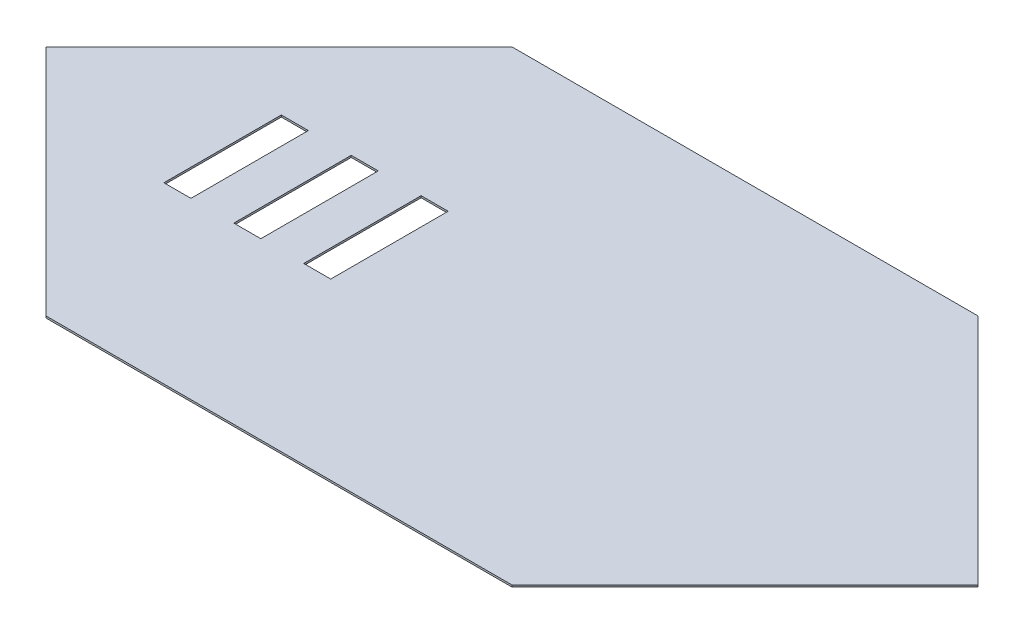
ISO-10303-21;
HEADER;
FILE_DESCRIPTION(('STEP AP214'),'2;1');
FILE_NAME('part.step','',(''),(''),'','','');
FILE_SCHEMA(('AUTOMOTIVE_DESIGN { 1 0 10303 214 1 1 1 1 }'));
ENDSEC;
DATA;
#1=APPLICATION_CONTEXT('core data for automotive mechanical design processes');
#2=APPLICATION_PROTOCOL_DEFINITION('international standard','automotive_design',2000,#1);
#3=PRODUCT_CONTEXT('',#1,'mechanical');
#4=PRODUCT('Part','Part','',(#3));
#5=PRODUCT_RELATED_PRODUCT_CATEGORY('part','',(#4));
#6=PRODUCT_DEFINITION_FORMATION('','',#4);
#7=PRODUCT_DEFINITION_CONTEXT('part definition',#1,'design');
#8=PRODUCT_DEFINITION('design','',#6,#7);
#9=PRODUCT_DEFINITION_SHAPE('','',#8);
#10=(LENGTH_UNIT() NAMED_UNIT(*) SI_UNIT(.MILLI.,.METRE.));
#11=(NAMED_UNIT(*) PLANE_ANGLE_UNIT() SI_UNIT($,.RADIAN.));
#12=(NAMED_UNIT(*) SI_UNIT($,.STERADIAN.) SOLID_ANGLE_UNIT());
#13=UNCERTAINTY_MEASURE_WITH_UNIT(LENGTH_MEASURE(1.E-05),#10,'distance_accuracy_value','');
#14=(GEOMETRIC_REPRESENTATION_CONTEXT(3) GLOBAL_UNCERTAINTY_ASSIGNED_CONTEXT((#13)) GLOBAL_UNIT_ASSIGNED_CONTEXT((#10,
#11,#12)) REPRESENTATION_CONTEXT('',''));
#15=CARTESIAN_POINT('',(0.,0.,0.));
#16=DIRECTION('',(0.,0.,1.));
#17=DIRECTION('',(1.,0.,0.));
#18=AXIS2_PLACEMENT_3D('',#15,#16,#17);
#19=CARTESIAN_POINT('',(-31.05,10.,0.));
#20=DIRECTION('',(-1.,0.,0.));
#21=DIRECTION('',(0.,0.,1.));
#22=AXIS2_PLACEMENT_3D('',#19,#20,#21);
#23=PLANE('',#22);
#24=DIRECTION('',(0.,1.,0.));
#25=VECTOR('',#24,1.);
#26=CARTESIAN_POINT('',(-31.05,10.,6.3000000000001));
#27=LINE('',#26,#25);
#28=CARTESIAN_POINT('',(-31.05,10.,6.3000000000001));
#29=VERTEX_POINT('',#28);
#30=CARTESIAN_POINT('',(-31.05,10.2,6.3000000000001));
#31=VERTEX_POINT('',#30);
#32=EDGE_CURVE('E11',#29,#31,#27,.T.);
#33=ORIENTED_EDGE('',*,*,#32,.F.);
#34=DIRECTION('',(0.,0.,1.));
#35=VECTOR('',#34,1.);
#36=CARTESIAN_POINT('',(-31.05,10.,0.));
#37=LINE('',#36,#35);
#38=CARTESIAN_POINT('',(-31.05,10.,-6.2999999999999));
#39=VERTEX_POINT('',#38);
#40=EDGE_CURVE('E135',#39,#29,#37,.T.);
#41=ORIENTED_EDGE('',*,*,#40,.F.);
#42=DIRECTION('',(0.,1.,0.));
#43=VECTOR('',#42,1.);
#44=CARTESIAN_POINT('',(-31.05,10.,-6.2999999999999));
#45=LINE('',#44,#43);
#46=CARTESIAN_POINT('',(-31.05,10.2,-6.2999999999999));
#47=VERTEX_POINT('',#46);
#48=EDGE_CURVE('E43',#39,#47,#45,.T.);
#49=ORIENTED_EDGE('',*,*,#48,.T.);
#50=DIRECTION('',(0.,0.,1.));
#51=VECTOR('',#50,1.);
#52=CARTESIAN_POINT('',(-31.05,10.2,0.));
#53=LINE('',#52,#51);
#54=EDGE_CURVE('E195',#47,#31,#53,.T.);
#55=ORIENTED_EDGE('',*,*,#54,.T.);
#56=EDGE_LOOP('',(#33,#41,#49,#55));
#57=FACE_BOUND('',#56,.T.);
#58=ADVANCED_FACE('F33',(#57),#23,.F.);
#59=CARTESIAN_POINT('',(0.,10.,-6.2999999999999));
#60=DIRECTION('',(0.,0.,1.));
#61=DIRECTION('',(1.,0.,0.));
#62=AXIS2_PLACEMENT_3D('',#59,#60,#61);
#63=PLANE('',#62);
#64=ORIENTED_EDGE('',*,*,#48,.F.);
#65=DIRECTION('',(1.,0.,0.));
#66=VECTOR('',#65,1.);
#67=CARTESIAN_POINT('',(0.,10.,-6.2999999999999));
#68=LINE('',#67,#66);
#69=CARTESIAN_POINT('',(-28.15,10.,-6.2999999999999));
#70=VERTEX_POINT('',#69);
#71=EDGE_CURVE('E147',#70,#39,#68,.F.);
#72=ORIENTED_EDGE('',*,*,#71,.F.);
#73=DIRECTION('',(0.,1.,0.));
#74=VECTOR('',#73,1.);
#75=CARTESIAN_POINT('',(-28.15,10.,-6.2999999999999));
#76=LINE('',#75,#74);
#77=CARTESIAN_POINT('',(-28.15,10.2,-6.2999999999999));
#78=VERTEX_POINT('',#77);
#79=EDGE_CURVE('E51',#70,#78,#76,.T.);
#80=ORIENTED_EDGE('',*,*,#79,.T.);
#81=DIRECTION('',(1.,0.,0.));
#82=VECTOR('',#81,1.);
#83=CARTESIAN_POINT('',(0.,10.2,-6.2999999999999));
#84=LINE('',#83,#82);
#85=EDGE_CURVE('E170',#78,#47,#84,.F.);
#86=ORIENTED_EDGE('',*,*,#85,.T.);
#87=EDGE_LOOP('',(#64,#72,#80,#86));
#88=FACE_BOUND('',#87,.T.);
#89=ADVANCED_FACE('F200',(#88),#63,.T.);
#90=CARTESIAN_POINT('',(-28.15,10.,0.));
#91=DIRECTION('',(-1.,0.,0.));
#92=DIRECTION('',(0.,0.,1.));
#93=AXIS2_PLACEMENT_3D('',#90,#91,#92);
#94=PLANE('',#93);
#95=ORIENTED_EDGE('',*,*,#79,.F.);
#96=DIRECTION('',(0.,0.,1.));
#97=VECTOR('',#96,1.);
#98=CARTESIAN_POINT('',(-28.15,10.,0.));
#99=LINE('',#98,#97);
#100=CARTESIAN_POINT('',(-28.15,10.,6.3000000000001));
#101=VERTEX_POINT('',#100);
#102=EDGE_CURVE('E134',#101,#70,#99,.F.);
#103=ORIENTED_EDGE('',*,*,#102,.F.);
#104=DIRECTION('',(0.,1.,0.));
#105=VECTOR('',#104,1.);
#106=CARTESIAN_POINT('',(-28.15,10.,6.3000000000001));
#107=LINE('',#106,#105);
#108=CARTESIAN_POINT('',(-28.15,10.2,6.3000000000001));
#109=VERTEX_POINT('',#108);
#110=EDGE_CURVE('E37',#101,#109,#107,.T.);
#111=ORIENTED_EDGE('',*,*,#110,.T.);
#112=DIRECTION('',(0.,0.,1.));
#113=VECTOR('',#112,1.);
#114=CARTESIAN_POINT('',(-28.15,10.2,0.));
#115=LINE('',#114,#113);
#116=EDGE_CURVE('E203',#109,#78,#115,.F.);
#117=ORIENTED_EDGE('',*,*,#116,.T.);
#118=EDGE_LOOP('',(#95,#103,#111,#117));
#119=FACE_BOUND('',#118,.T.);
#120=ADVANCED_FACE('F137',(#119),#94,.T.);
#121=CARTESIAN_POINT('',(-23.55,10.,0.));
#122=DIRECTION('',(-1.,0.,0.));
#123=DIRECTION('',(0.,0.,1.));
#124=AXIS2_PLACEMENT_3D('',#121,#122,#123);
#125=PLANE('',#124);
#126=DIRECTION('',(0.,1.,0.));
#127=VECTOR('',#126,1.);
#128=CARTESIAN_POINT('',(-23.55,10.,6.30000000000005));
#129=LINE('',#128,#127);
#130=CARTESIAN_POINT('',(-23.55,10.,6.30000000000005));
#131=VERTEX_POINT('',#130);
#132=CARTESIAN_POINT('',(-23.55,10.2,6.30000000000005));
#133=VERTEX_POINT('',#132);
#134=EDGE_CURVE('E129',#131,#133,#129,.T.);
#135=ORIENTED_EDGE('',*,*,#134,.F.);
#136=DIRECTION('',(0.,0.,1.));
#137=VECTOR('',#136,1.);
#138=CARTESIAN_POINT('',(-23.55,10.,0.));
#139=LINE('',#138,#137);
#140=CARTESIAN_POINT('',(-23.55,10.,-6.29999999999995));
#141=VERTEX_POINT('',#140);
#142=EDGE_CURVE('E141',#141,#131,#139,.T.);
#143=ORIENTED_EDGE('',*,*,#142,.F.);
#144=DIRECTION('',(0.,1.,0.));
#145=VECTOR('',#144,1.);
#146=CARTESIAN_POINT('',(-23.55,10.,-6.29999999999995));
#147=LINE('',#146,#145);
#148=CARTESIAN_POINT('',(-23.55,10.2,-6.29999999999995));
#149=VERTEX_POINT('',#148);
#150=EDGE_CURVE('E186',#141,#149,#147,.T.);
#151=ORIENTED_EDGE('',*,*,#150,.T.);
#152=DIRECTION('',(0.,0.,1.));
#153=VECTOR('',#152,1.);
#154=CARTESIAN_POINT('',(-23.55,10.2,0.));
#155=LINE('',#154,#153);
#156=EDGE_CURVE('E333',#149,#133,#155,.T.);
#157=ORIENTED_EDGE('',*,*,#156,.T.);
#158=EDGE_LOOP('',(#135,#143,#151,#157));
#159=FACE_BOUND('',#158,.T.);
#160=ADVANCED_FACE('F339',(#159),#125,.F.);
#161=CARTESIAN_POINT('',(0.,10.,-6.29999999999995));
#162=DIRECTION('',(0.,0.,1.));
#163=DIRECTION('',(1.,0.,0.));
#164=AXIS2_PLACEMENT_3D('',#161,#162,#163);
#165=PLANE('',#164);
#166=ORIENTED_EDGE('',*,*,#150,.F.);
#167=DIRECTION('',(1.,0.,0.));
#168=VECTOR('',#167,1.);
#169=CARTESIAN_POINT('',(0.,10.,-6.29999999999995));
#170=LINE('',#169,#168);
#171=CARTESIAN_POINT('',(-20.65,10.,-6.29999999999995));
#172=VERTEX_POINT('',#171);
#173=EDGE_CURVE('E138',#172,#141,#170,.F.);
#174=ORIENTED_EDGE('',*,*,#173,.F.);
#175=DIRECTION('',(0.,1.,0.));
#176=VECTOR('',#175,1.);
#177=CARTESIAN_POINT('',(-20.65,10.,-6.29999999999995));
#178=LINE('',#177,#176);
#179=CARTESIAN_POINT('',(-20.65,10.2,-6.29999999999995));
#180=VERTEX_POINT('',#179);
#181=EDGE_CURVE('E183',#172,#180,#178,.T.);
#182=ORIENTED_EDGE('',*,*,#181,.T.);
#183=DIRECTION('',(1.,0.,0.));
#184=VECTOR('',#183,1.);
#185=CARTESIAN_POINT('',(0.,10.2,-6.29999999999995));
#186=LINE('',#185,#184);
#187=EDGE_CURVE('E257',#180,#149,#186,.F.);
#188=ORIENTED_EDGE('',*,*,#187,.T.);
#189=EDGE_LOOP('',(#166,#174,#182,#188));
#190=FACE_BOUND('',#189,.T.);
#191=ADVANCED_FACE('F255',(#190),#165,.T.);
#192=CARTESIAN_POINT('',(-20.65,10.,0.));
#193=DIRECTION('',(-1.,0.,0.));
#194=DIRECTION('',(0.,0.,1.));
#195=AXIS2_PLACEMENT_3D('',#192,#193,#194);
#196=PLANE('',#195);
#197=ORIENTED_EDGE('',*,*,#181,.F.);
#198=DIRECTION('',(0.,0.,1.));
#199=VECTOR('',#198,1.);
#200=CARTESIAN_POINT('',(-20.65,10.,0.));
#201=LINE('',#200,#199);
#202=CARTESIAN_POINT('',(-20.65,10.,6.30000000000005));
#203=VERTEX_POINT('',#202);
#204=EDGE_CURVE('E232',#203,#172,#201,.F.);
#205=ORIENTED_EDGE('',*,*,#204,.F.);
#206=DIRECTION('',(0.,1.,0.));
#207=VECTOR('',#206,1.);
#208=CARTESIAN_POINT('',(-20.65,10.,6.30000000000005));
#209=LINE('',#208,#207);
#210=CARTESIAN_POINT('',(-20.65,10.2,6.30000000000005));
#211=VERTEX_POINT('',#210);
#212=EDGE_CURVE('E180',#203,#211,#209,.T.);
#213=ORIENTED_EDGE('',*,*,#212,.T.);
#214=DIRECTION('',(0.,0.,1.));
#215=VECTOR('',#214,1.);
#216=CARTESIAN_POINT('',(-20.65,10.2,0.));
#217=LINE('',#216,#215);
#218=EDGE_CURVE('E251',#211,#180,#217,.F.);
#219=ORIENTED_EDGE('',*,*,#218,.T.);
#220=EDGE_LOOP('',(#197,#205,#213,#219));
#221=FACE_BOUND('',#220,.T.);
#222=ADVANCED_FACE('F248',(#221),#196,.T.);
#223=CARTESIAN_POINT('',(-16.05,10.,0.));
#224=DIRECTION('',(-1.,0.,0.));
#225=DIRECTION('',(0.,0.,1.));
#226=AXIS2_PLACEMENT_3D('',#223,#224,#225);
#227=PLANE('',#226);
#228=DIRECTION('',(0.,1.,0.));
#229=VECTOR('',#228,1.);
#230=CARTESIAN_POINT('',(-16.05,10.,6.3));
#231=LINE('',#230,#229);
#232=CARTESIAN_POINT('',(-16.05,10.,6.3));
#233=VERTEX_POINT('',#232);
#234=CARTESIAN_POINT('',(-16.05,10.2,6.3));
#235=VERTEX_POINT('',#234);
#236=EDGE_CURVE('E177',#233,#235,#231,.T.);
#237=ORIENTED_EDGE('',*,*,#236,.F.);
#238=DIRECTION('',(0.,0.,1.));
#239=VECTOR('',#238,1.);
#240=CARTESIAN_POINT('',(-16.05,10.,0.));
#241=LINE('',#240,#239);
#242=CARTESIAN_POINT('',(-16.05,10.,-6.3));
#243=VERTEX_POINT('',#242);
#244=EDGE_CURVE('E233',#243,#233,#241,.T.);
#245=ORIENTED_EDGE('',*,*,#244,.F.);
#246=DIRECTION('',(0.,1.,0.));
#247=VECTOR('',#246,1.);
#248=CARTESIAN_POINT('',(-16.05,10.,-6.3));
#249=LINE('',#248,#247);
#250=CARTESIAN_POINT('',(-16.05,10.2,-6.3));
#251=VERTEX_POINT('',#250);
#252=EDGE_CURVE('E174',#243,#251,#249,.T.);
#253=ORIENTED_EDGE('',*,*,#252,.T.);
#254=DIRECTION('',(0.,0.,1.));
#255=VECTOR('',#254,1.);
#256=CARTESIAN_POINT('',(-16.05,10.2,0.));
#257=LINE('',#256,#255);
#258=EDGE_CURVE('E326',#251,#235,#257,.T.);
#259=ORIENTED_EDGE('',*,*,#258,.T.);
#260=EDGE_LOOP('',(#237,#245,#253,#259));
#261=FACE_BOUND('',#260,.T.);
#262=ADVANCED_FACE('F367',(#261),#227,.F.);
#263=CARTESIAN_POINT('',(0.,10.,-6.3));
#264=DIRECTION('',(0.,0.,1.));
#265=DIRECTION('',(1.,0.,0.));
#266=AXIS2_PLACEMENT_3D('',#263,#264,#265);
#267=PLANE('',#266);
#268=ORIENTED_EDGE('',*,*,#252,.F.);
#269=DIRECTION('',(1.,0.,0.));
#270=VECTOR('',#269,1.);
#271=CARTESIAN_POINT('',(0.,10.,-6.3));
#272=LINE('',#271,#270);
#273=CARTESIAN_POINT('',(-13.15,10.,-6.3));
#274=VERTEX_POINT('',#273);
#275=EDGE_CURVE('E229',#274,#243,#272,.F.);
#276=ORIENTED_EDGE('',*,*,#275,.F.);
#277=DIRECTION('',(0.,1.,0.));
#278=VECTOR('',#277,1.);
#279=CARTESIAN_POINT('',(-13.15,10.,-6.3));
#280=LINE('',#279,#278);
#281=CARTESIAN_POINT('',(-13.15,10.2,-6.3));
#282=VERTEX_POINT('',#281);
#283=EDGE_CURVE('E171',#274,#282,#280,.T.);
#284=ORIENTED_EDGE('',*,*,#283,.T.);
#285=DIRECTION('',(1.,0.,0.));
#286=VECTOR('',#285,1.);
#287=CARTESIAN_POINT('',(0.,10.2,-6.3));
#288=LINE('',#287,#286);
#289=EDGE_CURVE('E324',#282,#251,#288,.F.);
#290=ORIENTED_EDGE('',*,*,#289,.T.);
#291=EDGE_LOOP('',(#268,#276,#284,#290));
#292=FACE_BOUND('',#291,.T.);
#293=ADVANCED_FACE('F373',(#292),#267,.T.);
#294=CARTESIAN_POINT('',(-13.15,10.,0.));
#295=DIRECTION('',(-1.,0.,0.));
#296=DIRECTION('',(0.,0.,1.));
#297=AXIS2_PLACEMENT_3D('',#294,#295,#296);
#298=PLANE('',#297);
#299=ORIENTED_EDGE('',*,*,#283,.F.);
#300=DIRECTION('',(0.,0.,1.));
#301=VECTOR('',#300,1.);
#302=CARTESIAN_POINT('',(-13.15,10.,0.));
#303=LINE('',#302,#301);
#304=CARTESIAN_POINT('',(-13.15,10.,6.3));
#305=VERTEX_POINT('',#304);
#306=EDGE_CURVE('E214',#305,#274,#303,.F.);
#307=ORIENTED_EDGE('',*,*,#306,.F.);
#308=DIRECTION('',(0.,1.,0.));
#309=VECTOR('',#308,1.);
#310=CARTESIAN_POINT('',(-13.15,10.,6.3));
#311=LINE('',#310,#309);
#312=CARTESIAN_POINT('',(-13.15,10.2,6.3));
#313=VERTEX_POINT('',#312);
#314=EDGE_CURVE('E167',#305,#313,#311,.T.);
#315=ORIENTED_EDGE('',*,*,#314,.T.);
#316=DIRECTION('',(0.,0.,1.));
#317=VECTOR('',#316,1.);
#318=CARTESIAN_POINT('',(-13.15,10.2,0.));
#319=LINE('',#318,#317);
#320=EDGE_CURVE('E321',#313,#282,#319,.F.);
#321=ORIENTED_EDGE('',*,*,#320,.T.);
#322=EDGE_LOOP('',(#299,#307,#315,#321));
#323=FACE_BOUND('',#322,.T.);
#324=ADVANCED_FACE('F378',(#323),#298,.T.);
#325=CARTESIAN_POINT('',(25.,10.,25.));
#326=DIRECTION('',(-0.707106781186548,0.,-0.707106781186547));
#327=DIRECTION('',(-0.707106781186547,0.,0.707106781186548));
#328=AXIS2_PLACEMENT_3D('',#325,#326,#327);
#329=PLANE('',#328);
#330=DIRECTION('',(0.,1.,0.));
#331=VECTOR('',#330,1.);
#332=CARTESIAN_POINT('',(25.,10.,25.));
#333=LINE('',#332,#331);
#334=CARTESIAN_POINT('',(25.,10.,25.));
#335=VERTEX_POINT('',#334);
#336=CARTESIAN_POINT('',(25.,10.2,25.));
#337=VERTEX_POINT('',#336);
#338=EDGE_CURVE('E164',#335,#337,#333,.T.);
#339=ORIENTED_EDGE('',*,*,#338,.F.);
#340=DIRECTION('',(-0.707106781186547,0.,0.707106781186548));
#341=VECTOR('',#340,1.);
#342=CARTESIAN_POINT('',(25.,10.,25.));
#343=LINE('',#342,#341);
#344=CARTESIAN_POINT('',(50.,10.,0.));
#345=VERTEX_POINT('',#344);
#346=EDGE_CURVE('E221',#345,#335,#343,.T.);
#347=ORIENTED_EDGE('',*,*,#346,.F.);
#348=DIRECTION('',(0.,1.,0.));
#349=VECTOR('',#348,1.);
#350=CARTESIAN_POINT('',(50.,10.,0.));
#351=LINE('',#350,#349);
#352=CARTESIAN_POINT('',(50.,10.2,0.));
#353=VERTEX_POINT('',#352);
#354=EDGE_CURVE('E161',#345,#353,#351,.T.);
#355=ORIENTED_EDGE('',*,*,#354,.T.);
#356=DIRECTION('',(-0.707106781186547,0.,0.707106781186548));
#357=VECTOR('',#356,1.);
#358=CARTESIAN_POINT('',(25.,10.2,25.));
#359=LINE('',#358,#357);
#360=EDGE_CURVE('E315',#353,#337,#359,.T.);
#361=ORIENTED_EDGE('',*,*,#360,.T.);
#362=EDGE_LOOP('',(#339,#347,#355,#361));
#363=FACE_BOUND('',#362,.T.);
#364=ADVANCED_FACE('F384',(#363),#329,.F.);
#365=CARTESIAN_POINT('',(25.,10.,-25.));
#366=DIRECTION('',(0.707106781186547,0.,-0.707106781186548));
#367=DIRECTION('',(-0.707106781186548,0.,-0.707106781186547));
#368=AXIS2_PLACEMENT_3D('',#365,#366,#367);
#369=PLANE('',#368);
#370=ORIENTED_EDGE('',*,*,#354,.F.);
#371=DIRECTION('',(-0.707106781186548,0.,-0.707106781186547));
#372=VECTOR('',#371,1.);
#373=CARTESIAN_POINT('',(25.,10.,-25.));
#374=LINE('',#373,#372);
#375=CARTESIAN_POINT('',(25.,10.,-25.));
#376=VERTEX_POINT('',#375);
#377=EDGE_CURVE('E218',#345,#376,#374,.T.);
#378=ORIENTED_EDGE('',*,*,#377,.T.);
#379=DIRECTION('',(0.,1.,0.));
#380=VECTOR('',#379,1.);
#381=CARTESIAN_POINT('',(25.,10.,-25.));
#382=LINE('',#381,#380);
#383=CARTESIAN_POINT('',(25.,10.2,-25.));
#384=VERTEX_POINT('',#383);
#385=EDGE_CURVE('E158',#376,#384,#382,.T.);
#386=ORIENTED_EDGE('',*,*,#385,.T.);
#387=DIRECTION('',(-0.707106781186548,0.,-0.707106781186547));
#388=VECTOR('',#387,1.);
#389=CARTESIAN_POINT('',(25.,10.2,-25.));
#390=LINE('',#389,#388);
#391=EDGE_CURVE('E317',#353,#384,#390,.T.);
#392=ORIENTED_EDGE('',*,*,#391,.F.);
#393=EDGE_LOOP('',(#370,#378,#386,#392));
#394=FACE_BOUND('',#393,.T.);
#395=ADVANCED_FACE('F389',(#394),#369,.T.);
#396=CARTESIAN_POINT('',(0.,10.,-25.));
#397=DIRECTION('',(0.,0.,1.));
#398=DIRECTION('',(1.,0.,0.));
#399=AXIS2_PLACEMENT_3D('',#396,#397,#398);
#400=PLANE('',#399);
#401=ORIENTED_EDGE('',*,*,#385,.F.);
#402=DIRECTION('',(1.,0.,0.));
#403=VECTOR('',#402,1.);
#404=CARTESIAN_POINT('',(0.,10.,-25.));
#405=LINE('',#404,#403);
#406=CARTESIAN_POINT('',(-25.,10.,-25.));
#407=VERTEX_POINT('',#406);
#408=EDGE_CURVE('E215',#376,#407,#405,.F.);
#409=ORIENTED_EDGE('',*,*,#408,.T.);
#410=DIRECTION('',(0.,1.,0.));
#411=VECTOR('',#410,1.);
#412=CARTESIAN_POINT('',(-25.,10.,-25.));
#413=LINE('',#412,#411);
#414=CARTESIAN_POINT('',(-25.,10.2,-25.));
#415=VERTEX_POINT('',#414);
#416=EDGE_CURVE('E154',#407,#415,#413,.T.);
#417=ORIENTED_EDGE('',*,*,#416,.T.);
#418=DIRECTION('',(1.,0.,0.));
#419=VECTOR('',#418,1.);
#420=CARTESIAN_POINT('',(0.,10.2,-25.));
#421=LINE('',#420,#419);
#422=EDGE_CURVE('E521',#384,#415,#421,.F.);
#423=ORIENTED_EDGE('',*,*,#422,.F.);
#424=EDGE_LOOP('',(#401,#409,#417,#423));
#425=FACE_BOUND('',#424,.T.);
#426=ADVANCED_FACE('F395',(#425),#400,.F.);
#427=CARTESIAN_POINT('',(-25.,10.,-25.));
#428=DIRECTION('',(0.707106781186548,0.,0.707106781186548));
#429=DIRECTION('',(0.707106781186548,0.,-0.707106781186548));
#430=AXIS2_PLACEMENT_3D('',#427,#428,#429);
#431=PLANE('',#430);
#432=ORIENTED_EDGE('',*,*,#416,.F.);
#433=DIRECTION('',(0.707106781186548,0.,-0.707106781186548));
#434=VECTOR('',#433,1.);
#435=CARTESIAN_POINT('',(-25.,10.,-25.));
#436=LINE('',#435,#434);
#437=CARTESIAN_POINT('',(-50.,10.,0.));
#438=VERTEX_POINT('',#437);
#439=EDGE_CURVE('E211',#438,#407,#436,.T.);
#440=ORIENTED_EDGE('',*,*,#439,.F.);
#441=DIRECTION('',(0.,1.,0.));
#442=VECTOR('',#441,1.);
#443=CARTESIAN_POINT('',(-50.,10.,0.));
#444=LINE('',#443,#442);
#445=CARTESIAN_POINT('',(-50.,10.2,0.));
#446=VERTEX_POINT('',#445);
#447=EDGE_CURVE('E151',#438,#446,#444,.T.);
#448=ORIENTED_EDGE('',*,*,#447,.T.);
#449=DIRECTION('',(0.707106781186548,0.,-0.707106781186548));
#450=VECTOR('',#449,1.);
#451=CARTESIAN_POINT('',(-25.,10.2,-25.));
#452=LINE('',#451,#450);
#453=EDGE_CURVE('E312',#446,#415,#452,.T.);
#454=ORIENTED_EDGE('',*,*,#453,.T.);
#455=EDGE_LOOP('',(#432,#440,#448,#454));
#456=FACE_BOUND('',#455,.T.);
#457=ADVANCED_FACE('F399',(#456),#431,.F.);
#458=CARTESIAN_POINT('',(-25.,10.,25.));
#459=DIRECTION('',(0.707106781186548,0.,-0.707106781186547));
#460=DIRECTION('',(-0.707106781186547,0.,-0.707106781186548));
#461=AXIS2_PLACEMENT_3D('',#458,#459,#460);
#462=PLANE('',#461);
#463=ORIENTED_EDGE('',*,*,#447,.F.);
#464=DIRECTION('',(-0.707106781186547,0.,-0.707106781186548));
#465=VECTOR('',#464,1.);
#466=CARTESIAN_POINT('',(-25.,10.,25.));
#467=LINE('',#466,#465);
#468=CARTESIAN_POINT('',(-25.,10.,25.));
#469=VERTEX_POINT('',#468);
#470=EDGE_CURVE('E207',#469,#438,#467,.T.);
#471=ORIENTED_EDGE('',*,*,#470,.F.);
#472=DIRECTION('',(0.,1.,0.));
#473=VECTOR('',#472,1.);
#474=CARTESIAN_POINT('',(-25.,10.,25.));
#475=LINE('',#474,#473);
#476=CARTESIAN_POINT('',(-25.,10.2,25.));
#477=VERTEX_POINT('',#476);
#478=EDGE_CURVE('E155',#469,#477,#475,.T.);
#479=ORIENTED_EDGE('',*,*,#478,.T.);
#480=DIRECTION('',(-0.707106781186547,0.,-0.707106781186548));
#481=VECTOR('',#480,1.);
#482=CARTESIAN_POINT('',(-25.,10.2,25.));
#483=LINE('',#482,#481);
#484=EDGE_CURVE('E149',#477,#446,#483,.T.);
#485=ORIENTED_EDGE('',*,*,#484,.T.);
#486=EDGE_LOOP('',(#463,#471,#479,#485));
#487=FACE_BOUND('',#486,.T.);
#488=ADVANCED_FACE('F303',(#487),#462,.F.);
#489=CARTESIAN_POINT('',(0.,10.,25.));
#490=DIRECTION('',(0.,0.,1.));
#491=DIRECTION('',(1.,0.,0.));
#492=AXIS2_PLACEMENT_3D('',#489,#490,#491);
#493=PLANE('',#492);
#494=DIRECTION('',(1.,0.,0.));
#495=VECTOR('',#494,1.);
#496=CARTESIAN_POINT('',(0.,10.,25.));
#497=LINE('',#496,#495);
#498=EDGE_CURVE('E210',#469,#335,#497,.T.);
#499=ORIENTED_EDGE('',*,*,#498,.T.);
#500=ORIENTED_EDGE('',*,*,#338,.T.);
#501=DIRECTION('',(1.,0.,0.));
#502=VECTOR('',#501,1.);
#503=CARTESIAN_POINT('',(0.,10.2,25.));
#504=LINE('',#503,#502);
#505=EDGE_CURVE('E309',#477,#337,#504,.T.);
#506=ORIENTED_EDGE('',*,*,#505,.F.);
#507=ORIENTED_EDGE('',*,*,#478,.F.);
#508=EDGE_LOOP('',(#499,#500,#506,#507));
#509=FACE_BOUND('',#508,.T.);
#510=ADVANCED_FACE('F314',(#509),#493,.T.);
#511=CARTESIAN_POINT('',(0.,10.,6.3));
#512=DIRECTION('',(0.,0.,1.));
#513=DIRECTION('',(1.,0.,0.));
#514=AXIS2_PLACEMENT_3D('',#511,#512,#513);
#515=PLANE('',#514);
#516=DIRECTION('',(1.,0.,0.));
#517=VECTOR('',#516,1.);
#518=CARTESIAN_POINT('',(0.,10.,6.3));
#519=LINE('',#518,#517);
#520=EDGE_CURVE('E228',#233,#305,#519,.T.);
#521=ORIENTED_EDGE('',*,*,#520,.F.);
#522=ORIENTED_EDGE('',*,*,#236,.T.);
#523=DIRECTION('',(1.,0.,0.));
#524=VECTOR('',#523,1.);
#525=CARTESIAN_POINT('',(0.,10.2,6.3));
#526=LINE('',#525,#524);
#527=EDGE_CURVE('E323',#235,#313,#526,.T.);
#528=ORIENTED_EDGE('',*,*,#527,.T.);
#529=ORIENTED_EDGE('',*,*,#314,.F.);
#530=EDGE_LOOP('',(#521,#522,#528,#529));
#531=FACE_BOUND('',#530,.T.);
#532=ADVANCED_FACE('F355',(#531),#515,.F.);
#533=CARTESIAN_POINT('',(0.,10.,6.30000000000005));
#534=DIRECTION('',(0.,0.,1.));
#535=DIRECTION('',(1.,0.,0.));
#536=AXIS2_PLACEMENT_3D('',#533,#534,#535);
#537=PLANE('',#536);
#538=DIRECTION('',(1.,0.,0.));
#539=VECTOR('',#538,1.);
#540=CARTESIAN_POINT('',(0.,10.,6.30000000000005));
#541=LINE('',#540,#539);
#542=EDGE_CURVE('E145',#131,#203,#541,.T.);
#543=ORIENTED_EDGE('',*,*,#542,.F.);
#544=ORIENTED_EDGE('',*,*,#134,.T.);
#545=DIRECTION('',(1.,0.,0.));
#546=VECTOR('',#545,1.);
#547=CARTESIAN_POINT('',(0.,10.2,6.30000000000005));
#548=LINE('',#547,#546);
#549=EDGE_CURVE('E331',#133,#211,#548,.T.);
#550=ORIENTED_EDGE('',*,*,#549,.T.);
#551=ORIENTED_EDGE('',*,*,#212,.F.);
#552=EDGE_LOOP('',(#543,#544,#550,#551));
#553=FACE_BOUND('',#552,.T.);
#554=ADVANCED_FACE('F335',(#553),#537,.F.);
#555=CARTESIAN_POINT('',(0.,10.,6.3000000000001));
#556=DIRECTION('',(0.,0.,1.));
#557=DIRECTION('',(1.,0.,0.));
#558=AXIS2_PLACEMENT_3D('',#555,#556,#557);
#559=PLANE('',#558);
#560=DIRECTION('',(1.,0.,0.));
#561=VECTOR('',#560,1.);
#562=CARTESIAN_POINT('',(0.,10.,6.3000000000001));
#563=LINE('',#562,#561);
#564=EDGE_CURVE('E123',#29,#101,#563,.T.);
#565=ORIENTED_EDGE('',*,*,#564,.F.);
#566=ORIENTED_EDGE('',*,*,#32,.T.);
#567=DIRECTION('',(1.,0.,0.));
#568=VECTOR('',#567,1.);
#569=CARTESIAN_POINT('',(0.,10.2,6.3000000000001));
#570=LINE('',#569,#568);
#571=EDGE_CURVE('E125',#31,#109,#570,.T.);
#572=ORIENTED_EDGE('',*,*,#571,.T.);
#573=ORIENTED_EDGE('',*,*,#110,.F.);
#574=EDGE_LOOP('',(#565,#566,#572,#573));
#575=FACE_BOUND('',#574,.T.);
#576=ADVANCED_FACE('F35',(#575),#559,.F.);
#577=CARTESIAN_POINT('',(0.,10.2,0.));
#578=DIRECTION('',(0.,1.,0.));
#579=DIRECTION('',(0.,0.,1.));
#580=AXIS2_PLACEMENT_3D('',#577,#578,#579);
#581=PLANE('',#580);
#582=ORIENTED_EDGE('',*,*,#484,.F.);
#583=ORIENTED_EDGE('',*,*,#505,.T.);
#584=ORIENTED_EDGE('',*,*,#360,.F.);
#585=ORIENTED_EDGE('',*,*,#391,.T.);
#586=ORIENTED_EDGE('',*,*,#422,.T.);
#587=ORIENTED_EDGE('',*,*,#453,.F.);
#588=EDGE_LOOP('',(#582,#583,#584,#585,#586,#587));
#589=FACE_BOUND('',#588,.T.);
#590=ORIENTED_EDGE('',*,*,#320,.F.);
#591=ORIENTED_EDGE('',*,*,#527,.F.);
#592=ORIENTED_EDGE('',*,*,#258,.F.);
#593=ORIENTED_EDGE('',*,*,#289,.F.);
#594=EDGE_LOOP('',(#590,#591,#592,#593));
#595=FACE_BOUND('',#594,.T.);
#596=ORIENTED_EDGE('',*,*,#218,.F.);
#597=ORIENTED_EDGE('',*,*,#549,.F.);
#598=ORIENTED_EDGE('',*,*,#156,.F.);
#599=ORIENTED_EDGE('',*,*,#187,.F.);
#600=EDGE_LOOP('',(#596,#597,#598,#599));
#601=FACE_BOUND('',#600,.T.);
#602=ORIENTED_EDGE('',*,*,#116,.F.);
#603=ORIENTED_EDGE('',*,*,#571,.F.);
#604=ORIENTED_EDGE('',*,*,#54,.F.);
#605=ORIENTED_EDGE('',*,*,#85,.F.);
#606=EDGE_LOOP('',(#602,#603,#604,#605));
#607=FACE_BOUND('',#606,.T.);
#608=ADVANCED_FACE('F198',(#589,#595,#601,#607),#581,.T.);
#609=CARTESIAN_POINT('',(0.,10.,0.));
#610=DIRECTION('',(0.,1.,0.));
#611=DIRECTION('',(0.,0.,1.));
#612=AXIS2_PLACEMENT_3D('',#609,#610,#611);
#613=PLANE('',#612);
#614=ORIENTED_EDGE('',*,*,#470,.T.);
#615=ORIENTED_EDGE('',*,*,#439,.T.);
#616=ORIENTED_EDGE('',*,*,#408,.F.);
#617=ORIENTED_EDGE('',*,*,#377,.F.);
#618=ORIENTED_EDGE('',*,*,#346,.T.);
#619=ORIENTED_EDGE('',*,*,#498,.F.);
#620=EDGE_LOOP('',(#614,#615,#616,#617,#618,#619));
#621=FACE_BOUND('',#620,.T.);
#622=ORIENTED_EDGE('',*,*,#306,.T.);
#623=ORIENTED_EDGE('',*,*,#275,.T.);
#624=ORIENTED_EDGE('',*,*,#244,.T.);
#625=ORIENTED_EDGE('',*,*,#520,.T.);
#626=EDGE_LOOP('',(#622,#623,#624,#625));
#627=FACE_BOUND('',#626,.T.);
#628=ORIENTED_EDGE('',*,*,#204,.T.);
#629=ORIENTED_EDGE('',*,*,#173,.T.);
#630=ORIENTED_EDGE('',*,*,#142,.T.);
#631=ORIENTED_EDGE('',*,*,#542,.T.);
#632=EDGE_LOOP('',(#628,#629,#630,#631));
#633=FACE_BOUND('',#632,.T.);
#634=ORIENTED_EDGE('',*,*,#102,.T.);
#635=ORIENTED_EDGE('',*,*,#71,.T.);
#636=ORIENTED_EDGE('',*,*,#40,.T.);
#637=ORIENTED_EDGE('',*,*,#564,.T.);
#638=EDGE_LOOP('',(#634,#635,#636,#637));
#639=FACE_BOUND('',#638,.T.);
#640=ADVANCED_FACE('F132',(#621,#627,#633,#639),#613,.F.);
#641=CLOSED_SHELL('',(#58,#89,#120,#160,#191,#222,#262,#293,#324,#364,#395,#426,#457,#488,#510,
#532,#554,#576,#608,#640));
#642=MANIFOLD_SOLID_BREP('B2',#641);
#643=ADVANCED_BREP_SHAPE_REPRESENTATION('',(#18,#642),#14);
#644=SHAPE_DEFINITION_REPRESENTATION(#9,#643);
ENDSEC;
END-ISO-10303-21;
